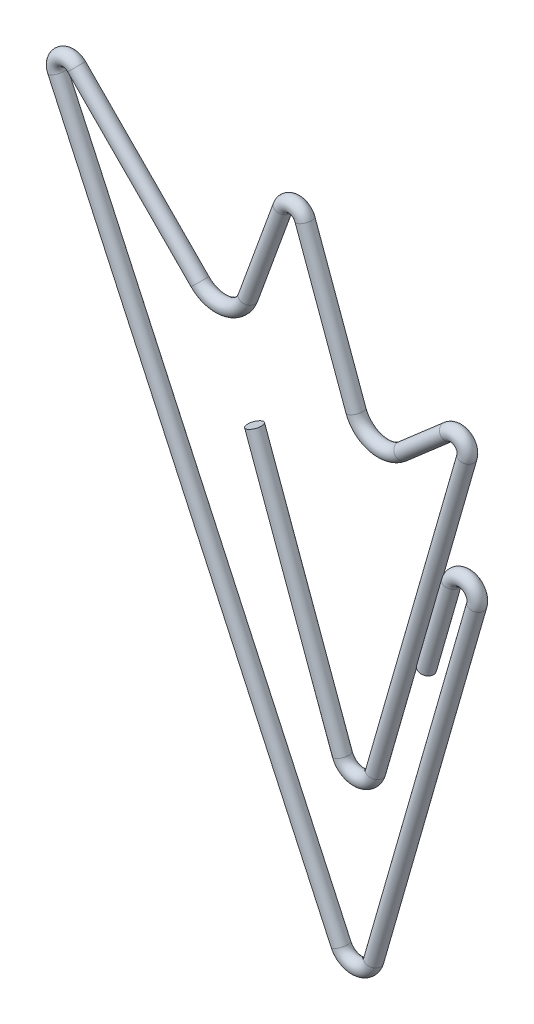
ISO-10303-21;
HEADER;
FILE_DESCRIPTION(('STEP AP214'),'2;1');
FILE_NAME('part.step','',(''),(''),'','','');
FILE_SCHEMA(('AUTOMOTIVE_DESIGN { 1 0 10303 214 1 1 1 1 }'));
ENDSEC;
DATA;
#1=APPLICATION_CONTEXT('core data for automotive mechanical design processes');
#2=APPLICATION_PROTOCOL_DEFINITION('international standard','automotive_design',2000,#1);
#3=PRODUCT_CONTEXT('',#1,'mechanical');
#4=PRODUCT('Part','Part','',(#3));
#5=PRODUCT_RELATED_PRODUCT_CATEGORY('part','',(#4));
#6=PRODUCT_DEFINITION_FORMATION('','',#4);
#7=PRODUCT_DEFINITION_CONTEXT('part definition',#1,'design');
#8=PRODUCT_DEFINITION('design','',#6,#7);
#9=PRODUCT_DEFINITION_SHAPE('','',#8);
#10=(LENGTH_UNIT() NAMED_UNIT(*) SI_UNIT(.MILLI.,.METRE.));
#11=(NAMED_UNIT(*) PLANE_ANGLE_UNIT() SI_UNIT($,.RADIAN.));
#12=(NAMED_UNIT(*) SI_UNIT($,.STERADIAN.) SOLID_ANGLE_UNIT());
#13=UNCERTAINTY_MEASURE_WITH_UNIT(LENGTH_MEASURE(1.E-05),#10,'distance_accuracy_value','');
#14=(GEOMETRIC_REPRESENTATION_CONTEXT(3) GLOBAL_UNCERTAINTY_ASSIGNED_CONTEXT((#13)) GLOBAL_UNIT_ASSIGNED_CONTEXT((#10,
#11,#12)) REPRESENTATION_CONTEXT('',''));
#15=CARTESIAN_POINT('',(0.,0.,0.));
#16=DIRECTION('',(0.,0.,1.));
#17=DIRECTION('',(1.,0.,0.));
#18=AXIS2_PLACEMENT_3D('',#15,#16,#17);
#19=CARTESIAN_POINT('',(33.7671761698764,-6.37981594941169,0.));
#20=DIRECTION('',(-0.275637355816993,-0.961261695938321,0.));
#21=DIRECTION('',(0.961261695938321,-0.275637355816993,0.));
#22=AXIS2_PLACEMENT_3D('',#19,#20,#21);
#23=CYLINDRICAL_SURFACE('',#22,1.25);
#24=CARTESIAN_POINT('',(33.7671761698764,-6.37981594941169,0.));
#25=DIRECTION('',(-0.275637355816672,-0.961261695938413,0.));
#26=DIRECTION('',(0.961261695938413,-0.275637355816672,0.));
#27=AXIS2_PLACEMENT_3D('',#24,#25,#26);
#28=CIRCLE('',#27,1.25);
#29=CARTESIAN_POINT('',(32.5655990499536,-6.03526925464041,0.));
#30=VERTEX_POINT('',#29);
#31=EDGE_CURVE('E37',#30,#30,#28,.T.);
#32=ORIENTED_EDGE('',*,*,#31,.T.);
#33=EDGE_LOOP('',(#32));
#34=FACE_BOUND('',#33,.T.);
#35=CARTESIAN_POINT('',(29.4659953834944,-21.3798159494117,0.));
#36=DIRECTION('',(-0.275637355816672,-0.961261695938413,0.));
#37=DIRECTION('',(0.961261695938413,-0.275637355816672,0.));
#38=AXIS2_PLACEMENT_3D('',#35,#36,#37);
#39=CIRCLE('',#38,1.25);
#40=CARTESIAN_POINT('',(30.6675725034174,-21.7243626441825,0.));
#41=VERTEX_POINT('',#40);
#42=EDGE_CURVE('E10',#41,#41,#39,.T.);
#43=ORIENTED_EDGE('',*,*,#42,.F.);
#44=EDGE_LOOP('',(#43));
#45=FACE_BOUND('',#44,.T.);
#46=ADVANCED_FACE('F31',(#34,#45),#23,.T.);
#47=CARTESIAN_POINT('',(35.9300149857376,-6.99999999999999,0.));
#48=DIRECTION('',(0.,0.,1.));
#49=DIRECTION('',(1.,0.,0.));
#50=AXIS2_PLACEMENT_3D('',#47,#48,#49);
#51=TOROIDAL_SURFACE('',#50,2.25,1.25);
#52=CARTESIAN_POINT('',(38.0928538015988,-7.6201840505883,0.));
#53=DIRECTION('',(0.275637355816672,0.961261695938413,0.));
#54=DIRECTION('',(-0.961261695938413,0.275637355816672,0.));
#55=AXIS2_PLACEMENT_3D('',#52,#53,#54);
#56=CIRCLE('',#55,1.25);
#57=CARTESIAN_POINT('',(39.2944309215217,-7.96473074535958,0.));
#58=VERTEX_POINT('',#57);
#59=EDGE_CURVE('E41',#58,#58,#56,.T.);
#60=CARTESIAN_POINT('',(35.9300149857376,-6.99999999999999,0.));
#61=DIRECTION('',(0.,0.,1.));
#62=DIRECTION('',(1.,0.,0.));
#63=AXIS2_PLACEMENT_3D('',#60,#61,#62);
#64=CIRCLE('',#63,3.5);
#65=EDGE_CURVE('',#58,#30,#64,.T.);
#66=ORIENTED_EDGE('',*,*,#59,.T.);
#67=ORIENTED_EDGE('',*,*,#31,.F.);
#68=ORIENTED_EDGE('',*,*,#65,.T.);
#69=ORIENTED_EDGE('',*,*,#65,.F.);
#70=EDGE_LOOP('',(#66,#68,#67,#69));
#71=FACE_BOUND('',#70,.T.);
#72=ADVANCED_FACE('F111',(#71),#51,.T.);
#73=CARTESIAN_POINT('',(20.4256731735241,-69.232964954884,0.));
#74=DIRECTION('',(0.275637355816993,0.961261695938321,0.));
#75=DIRECTION('',(-0.961261695938321,0.275637355816993,0.));
#76=AXIS2_PLACEMENT_3D('',#73,#74,#75);
#77=CYLINDRICAL_SURFACE('',#76,1.25);
#78=CARTESIAN_POINT('',(20.4256731735241,-69.232964954884,0.));
#79=DIRECTION('',(0.275637355816672,0.961261695938413,0.));
#80=DIRECTION('',(-0.961261695938413,0.275637355816672,0.));
#81=AXIS2_PLACEMENT_3D('',#78,#79,#80);
#82=CIRCLE('',#81,1.25);
#83=CARTESIAN_POINT('',(21.627250293447,-69.5775116496552,0.));
#84=VERTEX_POINT('',#83);
#85=EDGE_CURVE('E45',#84,#84,#82,.T.);
#86=ORIENTED_EDGE('',*,*,#85,.T.);
#87=EDGE_LOOP('',(#86));
#88=FACE_BOUND('',#87,.T.);
#89=ORIENTED_EDGE('',*,*,#59,.F.);
#90=EDGE_LOOP('',(#89));
#91=FACE_BOUND('',#90,.T.);
#92=ADVANCED_FACE('F115',(#88,#91),#77,.T.);
#93=CARTESIAN_POINT('',(17.5418880857091,-68.4060528874329,0.));
#94=DIRECTION('',(0.,0.,1.));
#95=DIRECTION('',(1.,0.,0.));
#96=AXIS2_PLACEMENT_3D('',#93,#94,#95);
#97=TOROIDAL_SURFACE('',#96,2.99999999999999,1.25);
#98=CARTESIAN_POINT('',(14.817205025438,-69.6614819858179,0.));
#99=DIRECTION('',(0.41847636612863,-0.908227686756893,0.));
#100=DIRECTION('',(0.908227686756893,0.41847636612863,0.));
#101=AXIS2_PLACEMENT_3D('',#98,#99,#100);
#102=CIRCLE('',#101,1.25);
#103=CARTESIAN_POINT('',(13.6819204169917,-70.1845774434783,0.));
#104=VERTEX_POINT('',#103);
#105=EDGE_CURVE('E50',#104,#104,#102,.T.);
#106=CARTESIAN_POINT('',(17.5418880857091,-68.4060528874329,0.));
#107=DIRECTION('',(0.,0.,1.));
#108=DIRECTION('',(1.,0.,0.));
#109=AXIS2_PLACEMENT_3D('',#106,#107,#108);
#110=CIRCLE('',#109,4.24999999999999);
#111=EDGE_CURVE('',#104,#84,#110,.T.);
#112=ORIENTED_EDGE('',*,*,#105,.T.);
#113=ORIENTED_EDGE('',*,*,#85,.F.);
#114=ORIENTED_EDGE('',*,*,#111,.T.);
#115=ORIENTED_EDGE('',*,*,#111,.F.);
#116=EDGE_LOOP('',(#112,#114,#113,#115));
#117=FACE_BOUND('',#116,.T.);
#118=ADVANCED_FACE('F121',(#117),#97,.T.);
#119=CARTESIAN_POINT('',(-33.7285599816665,35.6983696640424,0.));
#120=DIRECTION('',(0.418476366128326,-0.908227686757033,0.));
#121=DIRECTION('',(0.908227686757033,0.418476366128326,0.));
#122=AXIS2_PLACEMENT_3D('',#119,#120,#121);
#123=CYLINDRICAL_SURFACE('',#122,1.25);
#124=CARTESIAN_POINT('',(-33.7285599816665,35.6983696640424,0.));
#125=DIRECTION('',(0.41847636612863,-0.908227686756893,0.));
#126=DIRECTION('',(0.908227686756893,0.41847636612863,0.));
#127=AXIS2_PLACEMENT_3D('',#124,#125,#126);
#128=CIRCLE('',#127,1.25);
#129=CARTESIAN_POINT('',(-34.8638445901128,35.1752742063819,0.));
#130=VERTEX_POINT('',#129);
#131=EDGE_CURVE('E53',#130,#130,#128,.T.);
#132=ORIENTED_EDGE('',*,*,#131,.T.);
#133=EDGE_LOOP('',(#132));
#134=FACE_BOUND('',#133,.T.);
#135=ORIENTED_EDGE('',*,*,#105,.F.);
#136=EDGE_LOOP('',(#135));
#137=FACE_BOUND('',#136,.T.);
#138=ADVANCED_FACE('F128',(#134,#137),#123,.T.);
#139=CARTESIAN_POINT('',(-31.9121046081525,36.5353223962993,0.));
#140=DIRECTION('',(0.,0.,1.));
#141=DIRECTION('',(1.,0.,0.));
#142=AXIS2_PLACEMENT_3D('',#139,#140,#141);
#143=TOROIDAL_SURFACE('',#142,2.,1.25);
#144=CARTESIAN_POINT('',(-30.4914495911175,37.9430650299412,0.));
#145=DIRECTION('',(-0.703871316821139,0.710327508517357,0.));
#146=DIRECTION('',(-0.710327508517357,-0.703871316821139,0.));
#147=AXIS2_PLACEMENT_3D('',#144,#145,#146);
#148=CIRCLE('',#147,1.25);
#149=CARTESIAN_POINT('',(-29.6035402054706,38.8229041759674,0.));
#150=VERTEX_POINT('',#149);
#151=EDGE_CURVE('E56',#150,#150,#148,.T.);
#152=CARTESIAN_POINT('',(-31.9121046081525,36.5353223962993,0.));
#153=DIRECTION('',(0.,0.,1.));
#154=DIRECTION('',(1.,0.,0.));
#155=AXIS2_PLACEMENT_3D('',#152,#153,#154);
#156=CIRCLE('',#155,3.25);
#157=EDGE_CURVE('',#150,#130,#156,.T.);
#158=ORIENTED_EDGE('',*,*,#151,.T.);
#159=ORIENTED_EDGE('',*,*,#131,.F.);
#160=ORIENTED_EDGE('',*,*,#157,.T.);
#161=ORIENTED_EDGE('',*,*,#157,.F.);
#162=EDGE_LOOP('',(#158,#160,#159,#161));
#163=FACE_BOUND('',#162,.T.);
#164=ADVANCED_FACE('F132',(#163),#143,.T.);
#165=CARTESIAN_POINT('',(-9.3454812004542,16.6031372858098,0.));
#166=DIRECTION('',(-0.703871316821067,0.710327508517428,0.));
#167=DIRECTION('',(-0.710327508517429,-0.703871316821067,0.));
#168=AXIS2_PLACEMENT_3D('',#165,#166,#167);
#169=CYLINDRICAL_SURFACE('',#168,1.25);
#170=CARTESIAN_POINT('',(-9.3454812004542,16.6031372858098,0.));
#171=DIRECTION('',(-0.703871316821139,0.710327508517357,0.));
#172=DIRECTION('',(-0.710327508517357,-0.703871316821139,0.));
#173=AXIS2_PLACEMENT_3D('',#170,#171,#172);
#174=CIRCLE('',#173,1.25);
#175=CARTESIAN_POINT('',(-10.233390586101,15.7232981397835,0.));
#176=VERTEX_POINT('',#175);
#177=EDGE_CURVE('E59',#176,#176,#174,.T.);
#178=ORIENTED_EDGE('',*,*,#177,.T.);
#179=EDGE_LOOP('',(#178));
#180=FACE_BOUND('',#179,.T.);
#181=ORIENTED_EDGE('',*,*,#151,.F.);
#182=EDGE_LOOP('',(#181));
#183=FACE_BOUND('',#182,.T.);
#184=ADVANCED_FACE('F136',(#180,#183),#169,.T.);
#185=CARTESIAN_POINT('',(-5.79384365786704,20.1224938699152,0.));
#186=DIRECTION('',(0.,0.,-1.));
#187=DIRECTION('',(-1.,0.,0.));
#188=AXIS2_PLACEMENT_3D('',#185,#186,#187);
#189=TOROIDAL_SURFACE('',#188,5.,1.25);
#190=CARTESIAN_POINT('',(-1.09538055393745,18.4123931532869,0.));
#191=DIRECTION('',(-0.342020143325544,-0.939692620785954,0.));
#192=DIRECTION('',(0.939692620785954,-0.342020143325544,0.));
#193=AXIS2_PLACEMENT_3D('',#190,#191,#192);
#194=CIRCLE('',#193,1.25);
#195=CARTESIAN_POINT('',(0.0792352220449445,17.9848679741299,0.));
#196=VERTEX_POINT('',#195);
#197=EDGE_CURVE('E62',#196,#196,#194,.T.);
#198=CARTESIAN_POINT('',(-5.79384365786704,20.1224938699152,0.));
#199=DIRECTION('',(0.,0.,-1.));
#200=DIRECTION('',(-1.,0.,0.));
#201=AXIS2_PLACEMENT_3D('',#198,#199,#200);
#202=CIRCLE('',#201,6.25);
#203=EDGE_CURVE('',#196,#176,#202,.T.);
#204=ORIENTED_EDGE('',*,*,#197,.T.);
#205=ORIENTED_EDGE('',*,*,#177,.F.);
#206=ORIENTED_EDGE('',*,*,#203,.T.);
#207=ORIENTED_EDGE('',*,*,#203,.F.);
#208=EDGE_LOOP('',(#204,#206,#205,#207));
#209=FACE_BOUND('',#208,.T.);
#210=ADVANCED_FACE('F140',(#209),#189,.T.);
#211=CARTESIAN_POINT('',(4.88248052573541,34.8364314863251,0.));
#212=DIRECTION('',(-0.342020143325663,-0.939692620785911,0.));
#213=DIRECTION('',(0.939692620785911,-0.342020143325663,0.));
#214=AXIS2_PLACEMENT_3D('',#211,#212,#213);
#215=CYLINDRICAL_SURFACE('',#214,1.25);
#216=CARTESIAN_POINT('',(4.88248052573541,34.8364314863251,0.));
#217=DIRECTION('',(-0.342020143325544,-0.939692620785954,0.));
#218=DIRECTION('',(0.939692620785954,-0.342020143325544,0.));
#219=AXIS2_PLACEMENT_3D('',#216,#217,#218);
#220=CIRCLE('',#219,1.25);
#221=CARTESIAN_POINT('',(3.70786474975301,35.2639566654821,0.));
#222=VERTEX_POINT('',#221);
#223=EDGE_CURVE('E65',#222,#222,#220,.T.);
#224=ORIENTED_EDGE('',*,*,#223,.T.);
#225=EDGE_LOOP('',(#224));
#226=FACE_BOUND('',#225,.T.);
#227=ORIENTED_EDGE('',*,*,#197,.F.);
#228=EDGE_LOOP('',(#227));
#229=FACE_BOUND('',#228,.T.);
#230=ADVANCED_FACE('F144',(#226,#229),#215,.T.);
#231=CARTESIAN_POINT('',(6.76186576730723,34.1523911996738,0.));
#232=DIRECTION('',(0.,0.,1.));
#233=DIRECTION('',(1.,0.,0.));
#234=AXIS2_PLACEMENT_3D('',#231,#232,#233);
#235=TOROIDAL_SURFACE('',#234,1.99999999999999,1.25);
#236=CARTESIAN_POINT('',(8.64125100887908,34.836431486325,0.));
#237=DIRECTION('',(-0.342020143325732,0.939692620785885,0.));
#238=DIRECTION('',(-0.939692620785885,-0.342020143325732,0.));
#239=AXIS2_PLACEMENT_3D('',#236,#237,#238);
#240=CIRCLE('',#239,1.25);
#241=CARTESIAN_POINT('',(9.81586678486148,35.2639566654821,0.));
#242=VERTEX_POINT('',#241);
#243=EDGE_CURVE('E68',#242,#242,#240,.T.);
#244=CARTESIAN_POINT('',(6.76186576730723,34.1523911996738,0.));
#245=DIRECTION('',(0.,0.,1.));
#246=DIRECTION('',(1.,0.,0.));
#247=AXIS2_PLACEMENT_3D('',#244,#245,#246);
#248=CIRCLE('',#247,3.24999999999999);
#249=EDGE_CURVE('',#242,#222,#248,.T.);
#250=ORIENTED_EDGE('',*,*,#243,.T.);
#251=ORIENTED_EDGE('',*,*,#223,.F.);
#252=ORIENTED_EDGE('',*,*,#249,.T.);
#253=ORIENTED_EDGE('',*,*,#249,.F.);
#254=EDGE_LOOP('',(#250,#252,#251,#253));
#255=FACE_BOUND('',#254,.T.);
#256=ADVANCED_FACE('F148',(#255),#235,.T.);
#257=CARTESIAN_POINT('',(17.376582218257,10.8363062371019,0.));
#258=DIRECTION('',(-0.34202014332567,0.939692620785908,0.));
#259=DIRECTION('',(-0.939692620785908,-0.34202014332567,0.));
#260=AXIS2_PLACEMENT_3D('',#257,#258,#259);
#261=CYLINDRICAL_SURFACE('',#260,1.25);
#262=CARTESIAN_POINT('',(17.376582218257,10.8363062371019,0.));
#263=DIRECTION('',(-0.342020143325732,0.939692620785885,0.));
#264=DIRECTION('',(-0.939692620785885,-0.342020143325732,0.));
#265=AXIS2_PLACEMENT_3D('',#262,#263,#264);
#266=CIRCLE('',#265,1.25);
#267=CARTESIAN_POINT('',(16.2019664422746,10.4087810579449,0.));
#268=VERTEX_POINT('',#267);
#269=EDGE_CURVE('E71',#268,#268,#266,.T.);
#270=ORIENTED_EDGE('',*,*,#269,.T.);
#271=EDGE_LOOP('',(#270));
#272=FACE_BOUND('',#271,.T.);
#273=ORIENTED_EDGE('',*,*,#243,.F.);
#274=EDGE_LOOP('',(#273));
#275=FACE_BOUND('',#274,.T.);
#276=ADVANCED_FACE('F152',(#272,#275),#261,.T.);
#277=CARTESIAN_POINT('',(22.0750453221866,12.5464069537303,0.));
#278=DIRECTION('',(0.,0.,-1.));
#279=DIRECTION('',(-1.,0.,0.));
#280=AXIS2_PLACEMENT_3D('',#277,#278,#279);
#281=TOROIDAL_SURFACE('',#280,5.,1.25);
#282=CARTESIAN_POINT('',(25.3553404671392,8.7728590526165,0.));
#283=DIRECTION('',(-0.754709580222706,-0.656059028990583,0.));
#284=DIRECTION('',(0.656059028990583,-0.754709580222706,0.));
#285=AXIS2_PLACEMENT_3D('',#282,#283,#284);
#286=CIRCLE('',#285,1.25);
#287=CARTESIAN_POINT('',(26.1754142533774,7.82947207733806,0.));
#288=VERTEX_POINT('',#287);
#289=EDGE_CURVE('E74',#288,#288,#286,.T.);
#290=CARTESIAN_POINT('',(22.0750453221866,12.5464069537303,0.));
#291=DIRECTION('',(0.,0.,-1.));
#292=DIRECTION('',(-1.,0.,0.));
#293=AXIS2_PLACEMENT_3D('',#290,#291,#292);
#294=CIRCLE('',#293,6.25);
#295=EDGE_CURVE('',#288,#268,#294,.T.);
#296=ORIENTED_EDGE('',*,*,#289,.T.);
#297=ORIENTED_EDGE('',*,*,#269,.F.);
#298=ORIENTED_EDGE('',*,*,#295,.T.);
#299=ORIENTED_EDGE('',*,*,#295,.F.);
#300=EDGE_LOOP('',(#296,#298,#297,#299));
#301=FACE_BOUND('',#300,.T.);
#302=ADVANCED_FACE('F156',(#301),#281,.T.);
#303=CARTESIAN_POINT('',(33.1749750297869,15.5703636724956,0.));
#304=DIRECTION('',(-0.754709580222764,-0.656059028990516,0.));
#305=DIRECTION('',(0.656059028990516,-0.754709580222764,0.));
#306=AXIS2_PLACEMENT_3D('',#303,#304,#305);
#307=CYLINDRICAL_SURFACE('',#306,1.25);
#308=CARTESIAN_POINT('',(33.1749750297869,15.5703636724956,0.));
#309=DIRECTION('',(-0.754709580222706,-0.656059028990583,0.));
#310=DIRECTION('',(0.656059028990583,-0.754709580222706,0.));
#311=AXIS2_PLACEMENT_3D('',#308,#309,#310);
#312=CIRCLE('',#311,1.25);
#313=CARTESIAN_POINT('',(32.3549012435487,16.5137506477741,0.));
#314=VERTEX_POINT('',#313);
#315=EDGE_CURVE('E77',#314,#314,#312,.T.);
#316=ORIENTED_EDGE('',*,*,#315,.T.);
#317=EDGE_LOOP('',(#316));
#318=FACE_BOUND('',#317,.T.);
#319=ORIENTED_EDGE('',*,*,#289,.F.);
#320=EDGE_LOOP('',(#319));
#321=FACE_BOUND('',#320,.T.);
#322=ADVANCED_FACE('F160',(#318,#321),#307,.T.);
#323=CARTESIAN_POINT('',(34.4870930877679,14.0609445120502,0.));
#324=DIRECTION('',(0.,0.,1.));
#325=DIRECTION('',(1.,0.,0.));
#326=AXIS2_PLACEMENT_3D('',#323,#324,#325);
#327=TOROIDAL_SURFACE('',#326,2.,1.25);
#328=CARTESIAN_POINT('',(36.4096164796446,13.5096698004161,0.));
#329=DIRECTION('',(0.275637355816993,0.96126169593832,0.));
#330=DIRECTION('',(-0.961261695938321,0.275637355816993,0.));
#331=AXIS2_PLACEMENT_3D('',#328,#329,#330);
#332=CIRCLE('',#331,1.25);
#333=CARTESIAN_POINT('',(37.6111935995674,13.1651231056448,0.));
#334=VERTEX_POINT('',#333);
#335=EDGE_CURVE('E80',#334,#334,#332,.T.);
#336=CARTESIAN_POINT('',(34.4870930877679,14.0609445120502,0.));
#337=DIRECTION('',(0.,0.,1.));
#338=DIRECTION('',(1.,0.,0.));
#339=AXIS2_PLACEMENT_3D('',#336,#337,#338);
#340=CIRCLE('',#339,3.25);
#341=EDGE_CURVE('',#334,#314,#340,.T.);
#342=ORIENTED_EDGE('',*,*,#335,.T.);
#343=ORIENTED_EDGE('',*,*,#315,.F.);
#344=ORIENTED_EDGE('',*,*,#341,.T.);
#345=ORIENTED_EDGE('',*,*,#341,.F.);
#346=EDGE_LOOP('',(#342,#344,#343,#345));
#347=FACE_BOUND('',#346,.T.);
#348=ADVANCED_FACE('F164',(#347),#327,.T.);
#349=CARTESIAN_POINT('',(20.7434853699956,-41.1246221104803,0.));
#350=DIRECTION('',(0.275637355816993,0.961261695938321,0.));
#351=DIRECTION('',(-0.961261695938321,0.275637355816993,0.));
#352=AXIS2_PLACEMENT_3D('',#349,#350,#351);
#353=CYLINDRICAL_SURFACE('',#352,1.25);
#354=CARTESIAN_POINT('',(20.7434853699956,-41.1246221104803,0.));
#355=DIRECTION('',(0.275637355816993,0.96126169593832,0.));
#356=DIRECTION('',(-0.961261695938321,0.275637355816993,0.));
#357=AXIS2_PLACEMENT_3D('',#354,#355,#356);
#358=CIRCLE('',#357,1.25);
#359=CARTESIAN_POINT('',(21.9450624899185,-41.4691688052516,0.));
#360=VERTEX_POINT('',#359);
#361=EDGE_CURVE('E83',#360,#360,#358,.T.);
#362=ORIENTED_EDGE('',*,*,#361,.T.);
#363=EDGE_LOOP('',(#362));
#364=FACE_BOUND('',#363,.T.);
#365=ORIENTED_EDGE('',*,*,#335,.F.);
#366=EDGE_LOOP('',(#365));
#367=FACE_BOUND('',#366,.T.);
#368=ADVANCED_FACE('F168',(#364,#367),#353,.T.);
#369=CARTESIAN_POINT('',(17.8597002821807,-40.2977100430293,0.));
#370=DIRECTION('',(0.,0.,1.));
#371=DIRECTION('',(1.,0.,0.));
#372=AXIS2_PLACEMENT_3D('',#369,#370,#371);
#373=TOROIDAL_SURFACE('',#372,3.,1.25);
#374=CARTESIAN_POINT('',(15.0406224198229,-41.3237704730063,0.));
#375=DIRECTION('',(0.34202014332567,-0.939692620785908,0.));
#376=DIRECTION('',(0.939692620785908,0.34202014332567,0.));
#377=AXIS2_PLACEMENT_3D('',#374,#375,#376);
#378=CIRCLE('',#377,1.25);
#379=CARTESIAN_POINT('',(13.8660066438406,-41.7512956521634,0.));
#380=VERTEX_POINT('',#379);
#381=EDGE_CURVE('E86',#380,#380,#378,.T.);
#382=CARTESIAN_POINT('',(17.8597002821807,-40.2977100430293,0.));
#383=DIRECTION('',(0.,0.,1.));
#384=DIRECTION('',(1.,0.,0.));
#385=AXIS2_PLACEMENT_3D('',#382,#383,#384);
#386=CIRCLE('',#385,4.25);
#387=EDGE_CURVE('',#380,#360,#386,.T.);
#388=ORIENTED_EDGE('',*,*,#381,.T.);
#389=ORIENTED_EDGE('',*,*,#361,.F.);
#390=ORIENTED_EDGE('',*,*,#387,.T.);
#391=ORIENTED_EDGE('',*,*,#387,.F.);
#392=EDGE_LOOP('',(#388,#390,#389,#391));
#393=FACE_BOUND('',#392,.T.);
#394=ADVANCED_FACE('F93',(#393),#373,.T.);
#395=CARTESIAN_POINT('',(15.0406224198229,-41.3237704730063,0.));
#396=DIRECTION('',(-0.34202014332567,0.939692620785908,0.));
#397=DIRECTION('',(-0.939692620785908,-0.34202014332567,0.));
#398=AXIS2_PLACEMENT_3D('',#395,#396,#397);
#399=CYLINDRICAL_SURFACE('',#398,1.25);
#400=CARTESIAN_POINT('',(0.,0.,0.));
#401=DIRECTION('',(0.34202014332567,-0.939692620785908,0.));
#402=DIRECTION('',(0.939692620785908,0.34202014332567,0.));
#403=AXIS2_PLACEMENT_3D('',#400,#401,#402);
#404=CIRCLE('',#403,1.25);
#405=CARTESIAN_POINT('',(-1.17461577598238,-0.42752517915709,0.));
#406=VERTEX_POINT('',#405);
#407=EDGE_CURVE('E87',#406,#406,#404,.T.);
#408=CARTESIAN_POINT('',(13.8660066438405,-41.7512956521634,0.));
#409=CARTESIAN_POINT('',(13.7093334936341,-41.3208397097363,0.));
#410=CARTESIAN_POINT('',(13.5526603434276,-40.8903837673091,0.));
#411=CARTESIAN_POINT('',(13.2393140430146,-40.0294718824548,0.));
#412=CARTESIAN_POINT('',(13.0826408928081,-39.5990159400277,0.));
#413=CARTESIAN_POINT('',(12.7692945923951,-38.7381040551734,0.));
#414=CARTESIAN_POINT('',(12.6126214421886,-38.3076481127462,0.));
#415=CARTESIAN_POINT('',(12.2992751417757,-37.4467362278919,0.));
#416=CARTESIAN_POINT('',(12.1426019915692,-37.0162802854648,0.));
#417=CARTESIAN_POINT('',(11.8292556911562,-36.1553684006105,0.));
#418=CARTESIAN_POINT('',(11.6725825409497,-35.7249124581833,0.));
#419=CARTESIAN_POINT('',(11.3592362405367,-34.864000573329,0.));
#420=CARTESIAN_POINT('',(11.2025630903302,-34.4335446309019,0.));
#421=CARTESIAN_POINT('',(10.8892167899173,-33.5726327460476,0.));
#422=CARTESIAN_POINT('',(10.7325436397108,-33.1421768036204,0.));
#423=CARTESIAN_POINT('',(10.4191973392978,-32.2812649187661,0.));
#424=CARTESIAN_POINT('',(10.2625241890913,-31.850808976339,0.));
#425=CARTESIAN_POINT('',(9.94917788867833,-30.9898970914847,0.));
#426=CARTESIAN_POINT('',(9.79250473847184,-30.5594411490575,0.));
#427=CARTESIAN_POINT('',(9.47915843805886,-29.6985292642032,0.));
#428=CARTESIAN_POINT('',(9.32248528785237,-29.2680733217761,0.));
#429=CARTESIAN_POINT('',(9.00913898743939,-28.4071614369218,0.));
#430=CARTESIAN_POINT('',(8.85246583723291,-27.9767054944946,0.));
#431=CARTESIAN_POINT('',(8.53911953681993,-27.1157936096403,0.));
#432=CARTESIAN_POINT('',(8.38244638661344,-26.6853376672132,0.));
#433=CARTESIAN_POINT('',(8.06910008620046,-25.8244257823589,0.));
#434=CARTESIAN_POINT('',(7.91242693599397,-25.3939698399318,0.));
#435=CARTESIAN_POINT('',(7.59908063558099,-24.5330579550775,0.));
#436=CARTESIAN_POINT('',(7.44240748537451,-24.1026020126503,0.));
#437=CARTESIAN_POINT('',(7.12906118496153,-23.241690127796,0.));
#438=CARTESIAN_POINT('',(6.97238803475504,-22.8112341853689,0.));
#439=CARTESIAN_POINT('',(6.65904173434206,-21.9503223005146,0.));
#440=CARTESIAN_POINT('',(6.50236858413557,-21.5198663580874,0.));
#441=CARTESIAN_POINT('',(6.18902228372259,-20.6589544732331,0.));
#442=CARTESIAN_POINT('',(6.03234913351611,-20.228498530806,0.));
#443=CARTESIAN_POINT('',(5.71900283310313,-19.3675866459517,0.));
#444=CARTESIAN_POINT('',(5.56232968289664,-18.9371307035245,0.));
#445=CARTESIAN_POINT('',(5.24898338248366,-18.0762188186702,0.));
#446=CARTESIAN_POINT('',(5.09231023227717,-17.6457628762431,0.));
#447=CARTESIAN_POINT('',(4.77896393186419,-16.7848509913888,0.));
#448=CARTESIAN_POINT('',(4.62229078165771,-16.3543950489616,0.));
#449=CARTESIAN_POINT('',(4.30894448124473,-15.4934831641073,0.));
#450=CARTESIAN_POINT('',(4.15227133103824,-15.0630272216802,0.));
#451=CARTESIAN_POINT('',(3.83892503062526,-14.2021153368259,0.));
#452=CARTESIAN_POINT('',(3.68225188041877,-13.7716593943987,0.));
#453=CARTESIAN_POINT('',(3.36890558000579,-12.9107475095444,0.));
#454=CARTESIAN_POINT('',(3.21223242979931,-12.4802915671173,0.));
#455=CARTESIAN_POINT('',(2.89888612938633,-11.619379682263,0.));
#456=CARTESIAN_POINT('',(2.74221297917984,-11.1889237398358,0.));
#457=CARTESIAN_POINT('',(2.42886667876686,-10.3280118549815,0.));
#458=CARTESIAN_POINT('',(2.27219352856037,-9.89755591255438,0.));
#459=CARTESIAN_POINT('',(1.95884722814739,-9.03664402770008,0.));
#460=CARTESIAN_POINT('',(1.8021740779409,-8.60618808527293,0.));
#461=CARTESIAN_POINT('',(1.48882777752793,-7.74527620041863,0.));
#462=CARTESIAN_POINT('',(1.33215462732144,-7.31482025799148,0.));
#463=CARTESIAN_POINT('',(1.01880832690846,-6.45390837313718,0.));
#464=CARTESIAN_POINT('',(0.862135176701972,-6.02345243071003,0.));
#465=CARTESIAN_POINT('',(0.548788876288994,-5.16254054585573,0.));
#466=CARTESIAN_POINT('',(0.392115726082505,-4.73208460342858,0.));
#467=CARTESIAN_POINT('',(0.0787694256695271,-3.87117271857429,0.));
#468=CARTESIAN_POINT('',(-0.0779037245369612,-3.44071677614714,0.));
#469=CARTESIAN_POINT('',(-0.391250024949939,-2.57980489129284,0.));
#470=CARTESIAN_POINT('',(-0.547923175156429,-2.14934894886569,0.));
#471=CARTESIAN_POINT('',(-0.861269475569408,-1.28843706401139,0.));
#472=CARTESIAN_POINT('',(-1.0179426257759,-0.857981121584239,0.));
#473=CARTESIAN_POINT('',(-1.17461577598238,-0.42752517915709,0.));
#474=B_SPLINE_CURVE_WITH_KNOTS('',3,(#408,#409,#410,#411,#412,#413,#414,#415,#416,#417,#418,
#419,#420,#421,#422,#423,#424,#425,#426,#427,#428,#429,#430,#431,#432,#433,#434,#435,#436,#437,
#438,#439,#440,#441,#442,#443,#444,#445,#446,#447,#448,#449,#450,#451,#452,#453,#454,#455,#456,
#457,#458,#459,#460,#461,#462,#463,#464,#465,#466,#467,#468,#469,#470,#471,#472,#473),
.UNSPECIFIED.,.F.,.F.,(4,2,2,2,2,2,2,2,2,2,2,2,2,2,2,2,2,2,2,2,2,2,2,2,2,2,2,2,2,2,2,2,4),(0.,
1.37424493788343,2.74848987576686,4.12273481365029,5.49697975153372,6.87122468941715,
8.24546962730058,9.61971456518401,10.9939595030674,12.3682044409509,13.7424493788343,
15.1166943167177,16.4909392546012,17.8651841924846,19.239429130368,20.6136740682514,
21.9879190061349,23.3621639440183,24.7364088819017,26.1106538197852,27.4848987576686,
28.859143695552,30.2333886334354,31.6076335713189,32.9818785092023,34.3561234470857,
35.7303683849692,37.1046133228526,38.478858260736,39.8531031986195,41.2273481365029,
42.6015930743863,43.9758380122697),.UNSPECIFIED.);
#475=EDGE_CURVE('BSEAM96',#380,#406,#474,.T.);
#476=ORIENTED_EDGE('',*,*,#381,.F.);
#477=ORIENTED_EDGE('',*,*,#407,.T.);
#478=ORIENTED_EDGE('',*,*,#475,.T.);
#479=ORIENTED_EDGE('',*,*,#475,.F.);
#480=EDGE_LOOP('',(#476,#478,#477,#479));
#481=FACE_BOUND('',#480,.T.);
#482=ADVANCED_FACE('F96',(#481),#399,.T.);
#483=CARTESIAN_POINT('',(29.4659953834944,-21.3798159494117,0.));
#484=DIRECTION('',(-0.275637355816672,-0.961261695938413,0.));
#485=DIRECTION('',(0.961261695938413,-0.275637355816672,0.));
#486=AXIS2_PLACEMENT_3D('',#483,#484,#485);
#487=PLANE('',#486);
#488=ORIENTED_EDGE('',*,*,#42,.T.);
#489=EDGE_LOOP('',(#488));
#490=FACE_BOUND('',#489,.T.);
#491=ADVANCED_FACE('F99',(#490),#487,.T.);
#492=CARTESIAN_POINT('',(0.,0.,0.));
#493=DIRECTION('',(0.34202014332567,-0.939692620785908,0.));
#494=DIRECTION('',(0.939692620785908,0.34202014332567,0.));
#495=AXIS2_PLACEMENT_3D('',#492,#493,#494);
#496=PLANE('',#495);
#497=ORIENTED_EDGE('',*,*,#407,.F.);
#498=EDGE_LOOP('',(#497));
#499=FACE_BOUND('',#498,.T.);
#500=ADVANCED_FACE('F103',(#499),#496,.F.);
#501=CLOSED_SHELL('',(#46,#72,#92,#118,#138,#164,#184,#210,#230,#256,#276,#302,#322,#348,#368,
#394,#482,#491,#500));
#502=MANIFOLD_SOLID_BREP('B2',#501);
#503=ADVANCED_BREP_SHAPE_REPRESENTATION('',(#18,#502),#14);
#504=SHAPE_DEFINITION_REPRESENTATION(#9,#503);
ENDSEC;
END-ISO-10303-21;
